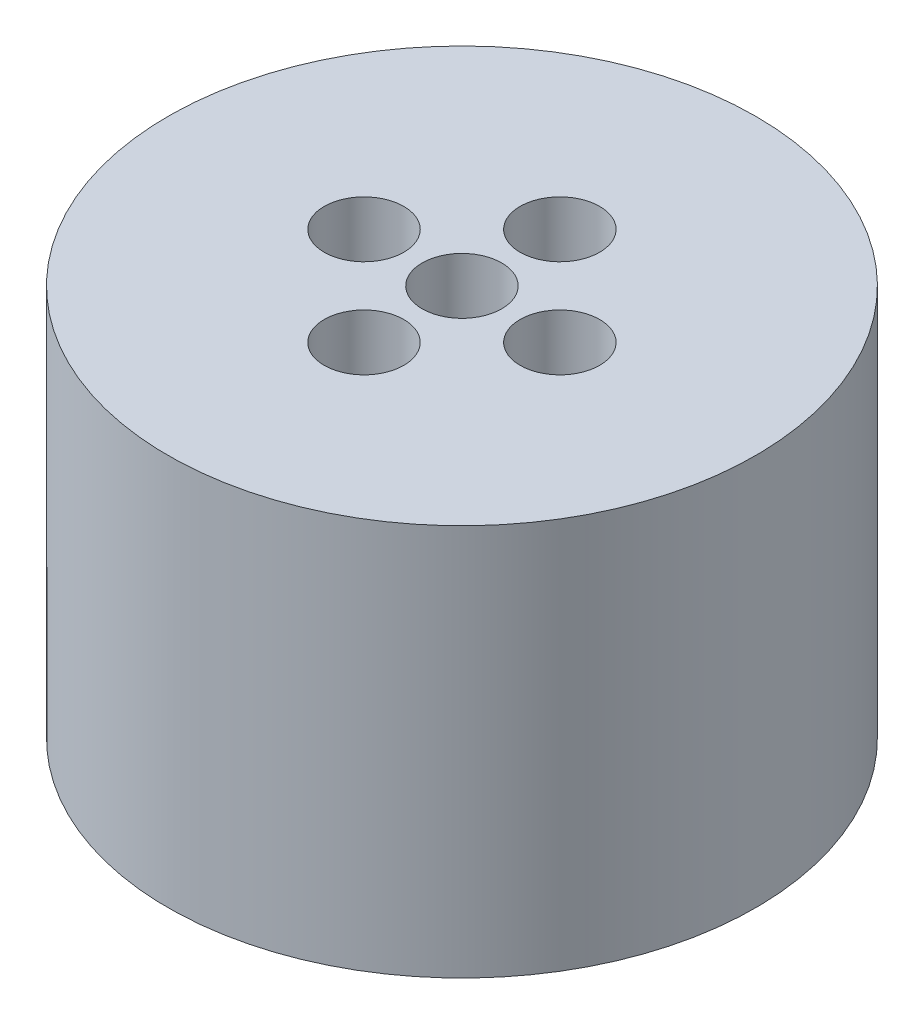
ISO-10303-21;
HEADER;
FILE_DESCRIPTION(('STEP AP214'),'2;1');
FILE_NAME('part.step','',(''),(''),'','','');
FILE_SCHEMA(('AUTOMOTIVE_DESIGN { 1 0 10303 214 1 1 1 1 }'));
ENDSEC;
DATA;
#1=APPLICATION_CONTEXT('core data for automotive mechanical design processes');
#2=APPLICATION_PROTOCOL_DEFINITION('international standard','automotive_design',2000,#1);
#3=PRODUCT_CONTEXT('',#1,'mechanical');
#4=PRODUCT('Part','Part','',(#3));
#5=PRODUCT_RELATED_PRODUCT_CATEGORY('part','',(#4));
#6=PRODUCT_DEFINITION_FORMATION('','',#4);
#7=PRODUCT_DEFINITION_CONTEXT('part definition',#1,'design');
#8=PRODUCT_DEFINITION('design','',#6,#7);
#9=PRODUCT_DEFINITION_SHAPE('','',#8);
#10=(LENGTH_UNIT() NAMED_UNIT(*) SI_UNIT(.MILLI.,.METRE.));
#11=(NAMED_UNIT(*) PLANE_ANGLE_UNIT() SI_UNIT($,.RADIAN.));
#12=(NAMED_UNIT(*) SI_UNIT($,.STERADIAN.) SOLID_ANGLE_UNIT());
#13=UNCERTAINTY_MEASURE_WITH_UNIT(LENGTH_MEASURE(1.E-05),#10,'distance_accuracy_value','');
#14=(GEOMETRIC_REPRESENTATION_CONTEXT(3) GLOBAL_UNCERTAINTY_ASSIGNED_CONTEXT((#13)) GLOBAL_UNIT_ASSIGNED_CONTEXT((#10,
#11,#12)) REPRESENTATION_CONTEXT('',''));
#15=CARTESIAN_POINT('',(0.,0.,0.));
#16=DIRECTION('',(0.,0.,1.));
#17=DIRECTION('',(1.,0.,0.));
#18=AXIS2_PLACEMENT_3D('',#15,#16,#17);
#19=CARTESIAN_POINT('',(0.,13.,0.));
#20=DIRECTION('',(0.,-1.,0.));
#21=DIRECTION('',(0.,0.,-1.));
#22=AXIS2_PLACEMENT_3D('',#19,#20,#21);
#23=CYLINDRICAL_SURFACE('',#22,11.);
#24=CARTESIAN_POINT('',(0.,13.,0.));
#25=DIRECTION('',(0.,1.,0.));
#26=DIRECTION('',(0.,0.,1.));
#27=AXIS2_PLACEMENT_3D('',#24,#25,#26);
#28=CIRCLE('',#27,11.);
#29=CARTESIAN_POINT('',(0.,13.,-11.));
#30=VERTEX_POINT('',#29);
#31=EDGE_CURVE('E51',#30,#30,#28,.T.);
#32=CARTESIAN_POINT('',(0.,0.,0.));
#33=DIRECTION('',(0.,1.,0.));
#34=DIRECTION('',(0.,0.,1.));
#35=AXIS2_PLACEMENT_3D('',#32,#33,#34);
#36=CIRCLE('',#35,11.);
#37=CARTESIAN_POINT('',(0.,0.,-11.));
#38=VERTEX_POINT('',#37);
#39=EDGE_CURVE('E46',#38,#38,#36,.T.);
#40=CARTESIAN_POINT('',(0.,13.,-11.));
#41=CARTESIAN_POINT('',(0.,12.8645833333333,-11.));
#42=CARTESIAN_POINT('',(0.,12.7291666666667,-11.));
#43=CARTESIAN_POINT('',(0.,12.4583333333333,-11.));
#44=CARTESIAN_POINT('',(0.,12.3229166666667,-11.));
#45=CARTESIAN_POINT('',(0.,12.0520833333333,-11.));
#46=CARTESIAN_POINT('',(0.,11.9166666666667,-11.));
#47=CARTESIAN_POINT('',(0.,11.6458333333333,-11.));
#48=CARTESIAN_POINT('',(0.,11.5104166666667,-11.));
#49=CARTESIAN_POINT('',(0.,11.2395833333333,-11.));
#50=CARTESIAN_POINT('',(0.,11.1041666666667,-11.));
#51=CARTESIAN_POINT('',(0.,10.8333333333333,-11.));
#52=CARTESIAN_POINT('',(0.,10.6979166666667,-11.));
#53=CARTESIAN_POINT('',(0.,10.4270833333333,-11.));
#54=CARTESIAN_POINT('',(0.,10.2916666666667,-11.));
#55=CARTESIAN_POINT('',(0.,10.0208333333333,-11.));
#56=CARTESIAN_POINT('',(0.,9.88541666666667,-11.));
#57=CARTESIAN_POINT('',(0.,9.61458333333333,-11.));
#58=CARTESIAN_POINT('',(0.,9.47916666666667,-11.));
#59=CARTESIAN_POINT('',(0.,9.20833333333333,-11.));
#60=CARTESIAN_POINT('',(0.,9.07291666666666,-11.));
#61=CARTESIAN_POINT('',(0.,8.80208333333333,-11.));
#62=CARTESIAN_POINT('',(0.,8.66666666666667,-11.));
#63=CARTESIAN_POINT('',(0.,8.39583333333333,-11.));
#64=CARTESIAN_POINT('',(0.,8.26041666666667,-11.));
#65=CARTESIAN_POINT('',(0.,7.98958333333333,-11.));
#66=CARTESIAN_POINT('',(0.,7.85416666666667,-11.));
#67=CARTESIAN_POINT('',(0.,7.58333333333333,-11.));
#68=CARTESIAN_POINT('',(0.,7.44791666666667,-11.));
#69=CARTESIAN_POINT('',(0.,7.17708333333333,-11.));
#70=CARTESIAN_POINT('',(0.,7.04166666666667,-11.));
#71=CARTESIAN_POINT('',(0.,6.77083333333333,-11.));
#72=CARTESIAN_POINT('',(0.,6.63541666666667,-11.));
#73=CARTESIAN_POINT('',(0.,6.36458333333333,-11.));
#74=CARTESIAN_POINT('',(0.,6.22916666666667,-11.));
#75=CARTESIAN_POINT('',(0.,5.95833333333333,-11.));
#76=CARTESIAN_POINT('',(0.,5.82291666666667,-11.));
#77=CARTESIAN_POINT('',(0.,5.55208333333333,-11.));
#78=CARTESIAN_POINT('',(0.,5.41666666666667,-11.));
#79=CARTESIAN_POINT('',(0.,5.14583333333333,-11.));
#80=CARTESIAN_POINT('',(0.,5.01041666666667,-11.));
#81=CARTESIAN_POINT('',(0.,4.73958333333333,-11.));
#82=CARTESIAN_POINT('',(0.,4.60416666666667,-11.));
#83=CARTESIAN_POINT('',(0.,4.33333333333333,-11.));
#84=CARTESIAN_POINT('',(0.,4.19791666666667,-11.));
#85=CARTESIAN_POINT('',(0.,3.92708333333333,-11.));
#86=CARTESIAN_POINT('',(0.,3.79166666666667,-11.));
#87=CARTESIAN_POINT('',(0.,3.52083333333333,-11.));
#88=CARTESIAN_POINT('',(0.,3.38541666666667,-11.));
#89=CARTESIAN_POINT('',(0.,3.11458333333333,-11.));
#90=CARTESIAN_POINT('',(0.,2.97916666666667,-11.));
#91=CARTESIAN_POINT('',(0.,2.70833333333333,-11.));
#92=CARTESIAN_POINT('',(0.,2.57291666666667,-11.));
#93=CARTESIAN_POINT('',(0.,2.30208333333333,-11.));
#94=CARTESIAN_POINT('',(0.,2.16666666666667,-11.));
#95=CARTESIAN_POINT('',(0.,1.89583333333333,-11.));
#96=CARTESIAN_POINT('',(0.,1.76041666666667,-11.));
#97=CARTESIAN_POINT('',(0.,1.48958333333333,-11.));
#98=CARTESIAN_POINT('',(0.,1.35416666666667,-11.));
#99=CARTESIAN_POINT('',(0.,1.08333333333333,-11.));
#100=CARTESIAN_POINT('',(0.,0.947916666666667,-11.));
#101=CARTESIAN_POINT('',(0.,0.677083333333334,-11.));
#102=CARTESIAN_POINT('',(0.,0.541666666666667,-11.));
#103=CARTESIAN_POINT('',(0.,0.270833333333334,-11.));
#104=CARTESIAN_POINT('',(0.,0.135416666666667,-11.));
#105=CARTESIAN_POINT('',(0.,0.,-11.));
#106=B_SPLINE_CURVE_WITH_KNOTS('',3,(#40,#41,#42,#43,#44,#45,#46,#47,#48,#49,#50,#51,#52,#53,
#54,#55,#56,#57,#58,#59,#60,#61,#62,#63,#64,#65,#66,#67,#68,#69,#70,#71,#72,#73,#74,#75,#76,#77,
#78,#79,#80,#81,#82,#83,#84,#85,#86,#87,#88,#89,#90,#91,#92,#93,#94,#95,#96,#97,#98,#99,#100,
#101,#102,#103,#104,#105),.UNSPECIFIED.,.F.,.F.,(4,2,2,2,2,2,2,2,2,2,2,2,2,2,2,2,2,2,2,2,2,2,2,
2,2,2,2,2,2,2,2,2,4),(0.,0.40625,0.812500000000001,1.21875,1.625,2.03125,2.4375,2.84375,3.25,
3.65625,4.0625,4.46875,4.875,5.28125,5.6875,6.09375,6.5,6.90625,7.3125,7.71875,8.125,8.53125,
8.9375,9.34375,9.75,10.15625,10.5625,10.96875,11.375,11.78125,12.1875,12.59375,13.),.UNSPECIFIED.);
#107=EDGE_CURVE('BSEAM39',#30,#38,#106,.T.);
#108=ORIENTED_EDGE('',*,*,#31,.T.);
#109=ORIENTED_EDGE('',*,*,#39,.F.);
#110=ORIENTED_EDGE('',*,*,#107,.T.);
#111=ORIENTED_EDGE('',*,*,#107,.F.);
#112=EDGE_LOOP('',(#108,#110,#109,#111));
#113=FACE_BOUND('',#112,.T.);
#114=ADVANCED_FACE('F39',(#113),#23,.F.);
#115=CARTESIAN_POINT('',(0.,13.,0.));
#116=DIRECTION('',(0.,-1.,0.));
#117=DIRECTION('',(0.,0.,-1.));
#118=AXIS2_PLACEMENT_3D('',#115,#116,#117);
#119=CYLINDRICAL_SURFACE('',#118,12.);
#120=CARTESIAN_POINT('',(0.,0.,0.));
#121=DIRECTION('',(0.,1.,0.));
#122=DIRECTION('',(0.,0.,1.));
#123=AXIS2_PLACEMENT_3D('',#120,#121,#122);
#124=CIRCLE('',#123,12.);
#125=CARTESIAN_POINT('',(0.,0.,-12.));
#126=VERTEX_POINT('',#125);
#127=EDGE_CURVE('E10',#126,#126,#124,.T.);
#128=CARTESIAN_POINT('',(0.,16.,0.));
#129=DIRECTION('',(0.,1.,0.));
#130=DIRECTION('',(0.,0.,1.));
#131=AXIS2_PLACEMENT_3D('',#128,#129,#130);
#132=CIRCLE('',#131,12.);
#133=CARTESIAN_POINT('',(0.,16.,-12.));
#134=VERTEX_POINT('',#133);
#135=EDGE_CURVE('E56',#134,#134,#132,.T.);
#136=CARTESIAN_POINT('',(0.,0.,-12.));
#137=CARTESIAN_POINT('',(0.,0.166666666666667,-12.));
#138=CARTESIAN_POINT('',(0.,0.333333333333334,-12.));
#139=CARTESIAN_POINT('',(0.,0.666666666666667,-12.));
#140=CARTESIAN_POINT('',(0.,0.833333333333334,-12.));
#141=CARTESIAN_POINT('',(0.,1.16666666666667,-12.));
#142=CARTESIAN_POINT('',(0.,1.33333333333333,-12.));
#143=CARTESIAN_POINT('',(0.,1.66666666666667,-12.));
#144=CARTESIAN_POINT('',(0.,1.83333333333333,-12.));
#145=CARTESIAN_POINT('',(0.,2.16666666666667,-12.));
#146=CARTESIAN_POINT('',(0.,2.33333333333333,-12.));
#147=CARTESIAN_POINT('',(0.,2.66666666666667,-12.));
#148=CARTESIAN_POINT('',(0.,2.83333333333333,-12.));
#149=CARTESIAN_POINT('',(0.,3.16666666666667,-12.));
#150=CARTESIAN_POINT('',(0.,3.33333333333333,-12.));
#151=CARTESIAN_POINT('',(0.,3.66666666666667,-12.));
#152=CARTESIAN_POINT('',(0.,3.83333333333333,-12.));
#153=CARTESIAN_POINT('',(0.,4.16666666666667,-12.));
#154=CARTESIAN_POINT('',(0.,4.33333333333333,-12.));
#155=CARTESIAN_POINT('',(0.,4.66666666666667,-12.));
#156=CARTESIAN_POINT('',(0.,4.83333333333333,-12.));
#157=CARTESIAN_POINT('',(0.,5.16666666666667,-12.));
#158=CARTESIAN_POINT('',(0.,5.33333333333333,-12.));
#159=CARTESIAN_POINT('',(0.,5.66666666666667,-12.));
#160=CARTESIAN_POINT('',(0.,5.83333333333333,-12.));
#161=CARTESIAN_POINT('',(0.,6.16666666666667,-12.));
#162=CARTESIAN_POINT('',(0.,6.33333333333333,-12.));
#163=CARTESIAN_POINT('',(0.,6.66666666666667,-12.));
#164=CARTESIAN_POINT('',(0.,6.83333333333333,-12.));
#165=CARTESIAN_POINT('',(0.,7.16666666666667,-12.));
#166=CARTESIAN_POINT('',(0.,7.33333333333333,-12.));
#167=CARTESIAN_POINT('',(0.,7.66666666666667,-12.));
#168=CARTESIAN_POINT('',(0.,7.83333333333333,-12.));
#169=CARTESIAN_POINT('',(0.,8.16666666666667,-12.));
#170=CARTESIAN_POINT('',(0.,8.33333333333333,-12.));
#171=CARTESIAN_POINT('',(0.,8.66666666666667,-12.));
#172=CARTESIAN_POINT('',(0.,8.83333333333333,-12.));
#173=CARTESIAN_POINT('',(0.,9.16666666666667,-12.));
#174=CARTESIAN_POINT('',(0.,9.33333333333333,-12.));
#175=CARTESIAN_POINT('',(0.,9.66666666666667,-12.));
#176=CARTESIAN_POINT('',(0.,9.83333333333333,-12.));
#177=CARTESIAN_POINT('',(0.,10.1666666666667,-12.));
#178=CARTESIAN_POINT('',(0.,10.3333333333333,-12.));
#179=CARTESIAN_POINT('',(0.,10.6666666666667,-12.));
#180=CARTESIAN_POINT('',(0.,10.8333333333333,-12.));
#181=CARTESIAN_POINT('',(0.,11.1666666666667,-12.));
#182=CARTESIAN_POINT('',(0.,11.3333333333333,-12.));
#183=CARTESIAN_POINT('',(0.,11.6666666666667,-12.));
#184=CARTESIAN_POINT('',(0.,11.8333333333333,-12.));
#185=CARTESIAN_POINT('',(0.,12.1666666666667,-12.));
#186=CARTESIAN_POINT('',(0.,12.3333333333333,-12.));
#187=CARTESIAN_POINT('',(0.,12.6666666666667,-12.));
#188=CARTESIAN_POINT('',(0.,12.8333333333333,-12.));
#189=CARTESIAN_POINT('',(0.,13.1666666666667,-12.));
#190=CARTESIAN_POINT('',(0.,13.3333333333333,-12.));
#191=CARTESIAN_POINT('',(0.,13.6666666666667,-12.));
#192=CARTESIAN_POINT('',(0.,13.8333333333333,-12.));
#193=CARTESIAN_POINT('',(0.,14.1666666666667,-12.));
#194=CARTESIAN_POINT('',(0.,14.3333333333333,-12.));
#195=CARTESIAN_POINT('',(0.,14.6666666666667,-12.));
#196=CARTESIAN_POINT('',(0.,14.8333333333333,-12.));
#197=CARTESIAN_POINT('',(0.,15.1666666666667,-12.));
#198=CARTESIAN_POINT('',(0.,15.3333333333333,-12.));
#199=CARTESIAN_POINT('',(0.,15.6666666666667,-12.));
#200=CARTESIAN_POINT('',(0.,15.8333333333333,-12.));
#201=CARTESIAN_POINT('',(0.,16.,-12.));
#202=B_SPLINE_CURVE_WITH_KNOTS('',3,(#136,#137,#138,#139,#140,#141,#142,#143,#144,#145,#146,
#147,#148,#149,#150,#151,#152,#153,#154,#155,#156,#157,#158,#159,#160,#161,#162,#163,#164,#165,
#166,#167,#168,#169,#170,#171,#172,#173,#174,#175,#176,#177,#178,#179,#180,#181,#182,#183,#184,
#185,#186,#187,#188,#189,#190,#191,#192,#193,#194,#195,#196,#197,#198,#199,#200,#201),
.UNSPECIFIED.,.F.,.F.,(4,2,2,2,2,2,2,2,2,2,2,2,2,2,2,2,2,2,2,2,2,2,2,2,2,2,2,2,2,2,2,2,4),(0.,
0.5,1.,1.5,2.,2.5,3.,3.5,4.,4.5,5.,5.5,6.,6.5,7.,7.5,8.,8.5,9.,9.5,10.,10.5,11.,11.5,12.,12.5,
13.,13.5,14.,14.5,15.,15.5,16.),.UNSPECIFIED.);
#203=EDGE_CURVE('BSEAM125',#126,#134,#202,.T.);
#204=ORIENTED_EDGE('',*,*,#127,.T.);
#205=ORIENTED_EDGE('',*,*,#135,.F.);
#206=ORIENTED_EDGE('',*,*,#203,.T.);
#207=ORIENTED_EDGE('',*,*,#203,.F.);
#208=EDGE_LOOP('',(#204,#206,#205,#207));
#209=FACE_BOUND('',#208,.T.);
#210=ADVANCED_FACE('F125',(#209),#119,.T.);
#211=CARTESIAN_POINT('',(0.,0.,0.));
#212=DIRECTION('',(0.,1.,0.));
#213=DIRECTION('',(0.,0.,1.));
#214=AXIS2_PLACEMENT_3D('',#211,#212,#213);
#215=PLANE('',#214);
#216=ORIENTED_EDGE('',*,*,#39,.T.);
#217=EDGE_LOOP('',(#216));
#218=FACE_BOUND('',#217,.T.);
#219=ORIENTED_EDGE('',*,*,#127,.F.);
#220=EDGE_LOOP('',(#219));
#221=FACE_BOUND('',#220,.T.);
#222=ADVANCED_FACE('F119',(#218,#221),#215,.F.);
#223=CARTESIAN_POINT('',(0.,13.,0.));
#224=DIRECTION('',(0.,1.,0.));
#225=DIRECTION('',(0.,0.,1.));
#226=AXIS2_PLACEMENT_3D('',#223,#224,#225);
#227=PLANE('',#226);
#228=CARTESIAN_POINT('',(-3.99999999999985,13.,1.47921923782994E-13));
#229=DIRECTION('',(0.,1.,0.));
#230=DIRECTION('',(0.,0.,1.));
#231=AXIS2_PLACEMENT_3D('',#228,#229,#230);
#232=CIRCLE('',#231,1.625);
#233=CARTESIAN_POINT('',(-3.99999999999985,13.,1.62500000000015));
#234=VERTEX_POINT('',#233);
#235=EDGE_CURVE('E95',#234,#234,#232,.T.);
#236=ORIENTED_EDGE('',*,*,#235,.T.);
#237=EDGE_LOOP('',(#236));
#238=FACE_BOUND('',#237,.T.);
#239=CARTESIAN_POINT('',(2.94864130126669E-13,13.,4.));
#240=DIRECTION('',(0.,1.,0.));
#241=DIRECTION('',(0.,0.,1.));
#242=AXIS2_PLACEMENT_3D('',#239,#240,#241);
#243=CIRCLE('',#242,1.625);
#244=CARTESIAN_POINT('',(2.94864130126669E-13,13.,5.625));
#245=VERTEX_POINT('',#244);
#246=EDGE_CURVE('E87',#245,#245,#243,.T.);
#247=ORIENTED_EDGE('',*,*,#246,.T.);
#248=EDGE_LOOP('',(#247));
#249=FACE_BOUND('',#248,.T.);
#250=CARTESIAN_POINT('',(4.00000000000015,13.,-1.47432065063335E-13));
#251=DIRECTION('',(0.,1.,0.));
#252=DIRECTION('',(0.,0.,1.));
#253=AXIS2_PLACEMENT_3D('',#250,#251,#252);
#254=CIRCLE('',#253,1.625);
#255=CARTESIAN_POINT('',(4.00000000000015,13.,1.62499999999985));
#256=VERTEX_POINT('',#255);
#257=EDGE_CURVE('E79',#256,#256,#254,.T.);
#258=ORIENTED_EDGE('',*,*,#257,.T.);
#259=EDGE_LOOP('',(#258));
#260=FACE_BOUND('',#259,.T.);
#261=CARTESIAN_POINT('',(0.,13.,-4.));
#262=DIRECTION('',(0.,1.,0.));
#263=DIRECTION('',(0.,0.,1.));
#264=AXIS2_PLACEMENT_3D('',#261,#262,#263);
#265=CIRCLE('',#264,1.625);
#266=CARTESIAN_POINT('',(0.,13.,-2.375));
#267=VERTEX_POINT('',#266);
#268=EDGE_CURVE('E71',#267,#267,#265,.T.);
#269=ORIENTED_EDGE('',*,*,#268,.T.);
#270=EDGE_LOOP('',(#269));
#271=FACE_BOUND('',#270,.T.);
#272=CARTESIAN_POINT('',(0.,13.,0.));
#273=DIRECTION('',(0.,1.,0.));
#274=DIRECTION('',(0.,0.,1.));
#275=AXIS2_PLACEMENT_3D('',#272,#273,#274);
#276=CIRCLE('',#275,1.625);
#277=CARTESIAN_POINT('',(0.,13.,1.625));
#278=VERTEX_POINT('',#277);
#279=EDGE_CURVE('E63',#278,#278,#276,.T.);
#280=ORIENTED_EDGE('',*,*,#279,.T.);
#281=EDGE_LOOP('',(#280));
#282=FACE_BOUND('',#281,.T.);
#283=ORIENTED_EDGE('',*,*,#31,.F.);
#284=EDGE_LOOP('',(#283));
#285=FACE_BOUND('',#284,.T.);
#286=ADVANCED_FACE('F109',(#238,#249,#260,#271,#282,#285),#227,.F.);
#287=CARTESIAN_POINT('',(0.,16.,0.));
#288=DIRECTION('',(0.,1.,0.));
#289=DIRECTION('',(0.,0.,1.));
#290=AXIS2_PLACEMENT_3D('',#287,#288,#289);
#291=PLANE('',#290);
#292=CARTESIAN_POINT('',(2.94864130126669E-13,16.,4.));
#293=DIRECTION('',(0.,1.,0.));
#294=DIRECTION('',(0.,0.,1.));
#295=AXIS2_PLACEMENT_3D('',#292,#293,#294);
#296=CIRCLE('',#295,1.625);
#297=CARTESIAN_POINT('',(2.94864130126669E-13,16.,5.625));
#298=VERTEX_POINT('',#297);
#299=EDGE_CURVE('E83',#298,#298,#296,.T.);
#300=ORIENTED_EDGE('',*,*,#299,.F.);
#301=EDGE_LOOP('',(#300));
#302=FACE_BOUND('',#301,.T.);
#303=CARTESIAN_POINT('',(0.,16.,-4.));
#304=DIRECTION('',(0.,1.,0.));
#305=DIRECTION('',(0.,0.,1.));
#306=AXIS2_PLACEMENT_3D('',#303,#304,#305);
#307=CIRCLE('',#306,1.625);
#308=CARTESIAN_POINT('',(0.,16.,-2.375));
#309=VERTEX_POINT('',#308);
#310=EDGE_CURVE('E67',#309,#309,#307,.T.);
#311=ORIENTED_EDGE('',*,*,#310,.F.);
#312=EDGE_LOOP('',(#311));
#313=FACE_BOUND('',#312,.T.);
#314=ORIENTED_EDGE('',*,*,#135,.T.);
#315=EDGE_LOOP('',(#314));
#316=FACE_BOUND('',#315,.T.);
#317=CARTESIAN_POINT('',(0.,16.,0.));
#318=DIRECTION('',(0.,1.,0.));
#319=DIRECTION('',(0.,0.,1.));
#320=AXIS2_PLACEMENT_3D('',#317,#318,#319);
#321=CIRCLE('',#320,1.625);
#322=CARTESIAN_POINT('',(0.,16.,1.625));
#323=VERTEX_POINT('',#322);
#324=EDGE_CURVE('E62',#323,#323,#321,.T.);
#325=ORIENTED_EDGE('',*,*,#324,.F.);
#326=EDGE_LOOP('',(#325));
#327=FACE_BOUND('',#326,.T.);
#328=CARTESIAN_POINT('',(4.00000000000015,16.,-1.47432065063335E-13));
#329=DIRECTION('',(0.,1.,0.));
#330=DIRECTION('',(0.,0.,1.));
#331=AXIS2_PLACEMENT_3D('',#328,#329,#330);
#332=CIRCLE('',#331,1.625);
#333=CARTESIAN_POINT('',(4.00000000000015,16.,1.62499999999985));
#334=VERTEX_POINT('',#333);
#335=EDGE_CURVE('E75',#334,#334,#332,.T.);
#336=ORIENTED_EDGE('',*,*,#335,.F.);
#337=EDGE_LOOP('',(#336));
#338=FACE_BOUND('',#337,.T.);
#339=CARTESIAN_POINT('',(-3.99999999999985,16.,1.47921923782994E-13));
#340=DIRECTION('',(0.,1.,0.));
#341=DIRECTION('',(0.,0.,1.));
#342=AXIS2_PLACEMENT_3D('',#339,#340,#341);
#343=CIRCLE('',#342,1.625);
#344=CARTESIAN_POINT('',(-3.99999999999985,16.,1.62500000000015));
#345=VERTEX_POINT('',#344);
#346=EDGE_CURVE('E91',#345,#345,#343,.T.);
#347=ORIENTED_EDGE('',*,*,#346,.F.);
#348=EDGE_LOOP('',(#347));
#349=FACE_BOUND('',#348,.T.);
#350=ADVANCED_FACE('F106',(#302,#313,#316,#327,#338,#349),#291,.T.);
#351=CARTESIAN_POINT('',(0.,16.,0.));
#352=DIRECTION('',(0.,-1.,0.));
#353=DIRECTION('',(0.,0.,-1.));
#354=AXIS2_PLACEMENT_3D('',#351,#352,#353);
#355=CYLINDRICAL_SURFACE('',#354,1.625);
#356=ORIENTED_EDGE('',*,*,#324,.T.);
#357=EDGE_LOOP('',(#356));
#358=FACE_BOUND('',#357,.T.);
#359=ORIENTED_EDGE('',*,*,#279,.F.);
#360=EDGE_LOOP('',(#359));
#361=FACE_BOUND('',#360,.T.);
#362=ADVANCED_FACE('F108',(#358,#361),#355,.F.);
#363=CARTESIAN_POINT('',(0.,16.,-4.));
#364=DIRECTION('',(0.,-1.,0.));
#365=DIRECTION('',(0.,0.,-1.));
#366=AXIS2_PLACEMENT_3D('',#363,#364,#365);
#367=CYLINDRICAL_SURFACE('',#366,1.625);
#368=ORIENTED_EDGE('',*,*,#310,.T.);
#369=EDGE_LOOP('',(#368));
#370=FACE_BOUND('',#369,.T.);
#371=ORIENTED_EDGE('',*,*,#268,.F.);
#372=EDGE_LOOP('',(#371));
#373=FACE_BOUND('',#372,.T.);
#374=ADVANCED_FACE('F116',(#370,#373),#367,.F.);
#375=CARTESIAN_POINT('',(4.00000000000015,16.,-1.47432065063335E-13));
#376=DIRECTION('',(0.,-1.,0.));
#377=DIRECTION('',(0.,0.,-1.));
#378=AXIS2_PLACEMENT_3D('',#375,#376,#377);
#379=CYLINDRICAL_SURFACE('',#378,1.625);
#380=ORIENTED_EDGE('',*,*,#335,.T.);
#381=EDGE_LOOP('',(#380));
#382=FACE_BOUND('',#381,.T.);
#383=ORIENTED_EDGE('',*,*,#257,.F.);
#384=EDGE_LOOP('',(#383));
#385=FACE_BOUND('',#384,.T.);
#386=ADVANCED_FACE('F145',(#382,#385),#379,.F.);
#387=CARTESIAN_POINT('',(2.94864130126669E-13,16.,4.));
#388=DIRECTION('',(0.,-1.,0.));
#389=DIRECTION('',(0.,0.,-1.));
#390=AXIS2_PLACEMENT_3D('',#387,#388,#389);
#391=CYLINDRICAL_SURFACE('',#390,1.625);
#392=ORIENTED_EDGE('',*,*,#299,.T.);
#393=EDGE_LOOP('',(#392));
#394=FACE_BOUND('',#393,.T.);
#395=ORIENTED_EDGE('',*,*,#246,.F.);
#396=EDGE_LOOP('',(#395));
#397=FACE_BOUND('',#396,.T.);
#398=ADVANCED_FACE('F148',(#394,#397),#391,.F.);
#399=CARTESIAN_POINT('',(-3.99999999999985,16.,1.47921923782994E-13));
#400=DIRECTION('',(0.,-1.,0.));
#401=DIRECTION('',(0.,0.,-1.));
#402=AXIS2_PLACEMENT_3D('',#399,#400,#401);
#403=CYLINDRICAL_SURFACE('',#402,1.625);
#404=ORIENTED_EDGE('',*,*,#346,.T.);
#405=EDGE_LOOP('',(#404));
#406=FACE_BOUND('',#405,.T.);
#407=ORIENTED_EDGE('',*,*,#235,.F.);
#408=EDGE_LOOP('',(#407));
#409=FACE_BOUND('',#408,.T.);
#410=ADVANCED_FACE('F103',(#406,#409),#403,.F.);
#411=CLOSED_SHELL('',(#114,#210,#222,#286,#350,#362,#374,#386,#398,#410));
#412=MANIFOLD_SOLID_BREP('B2',#411);
#413=ADVANCED_BREP_SHAPE_REPRESENTATION('',(#18,#412),#14);
#414=SHAPE_DEFINITION_REPRESENTATION(#9,#413);
ENDSEC;
END-ISO-10303-21;
